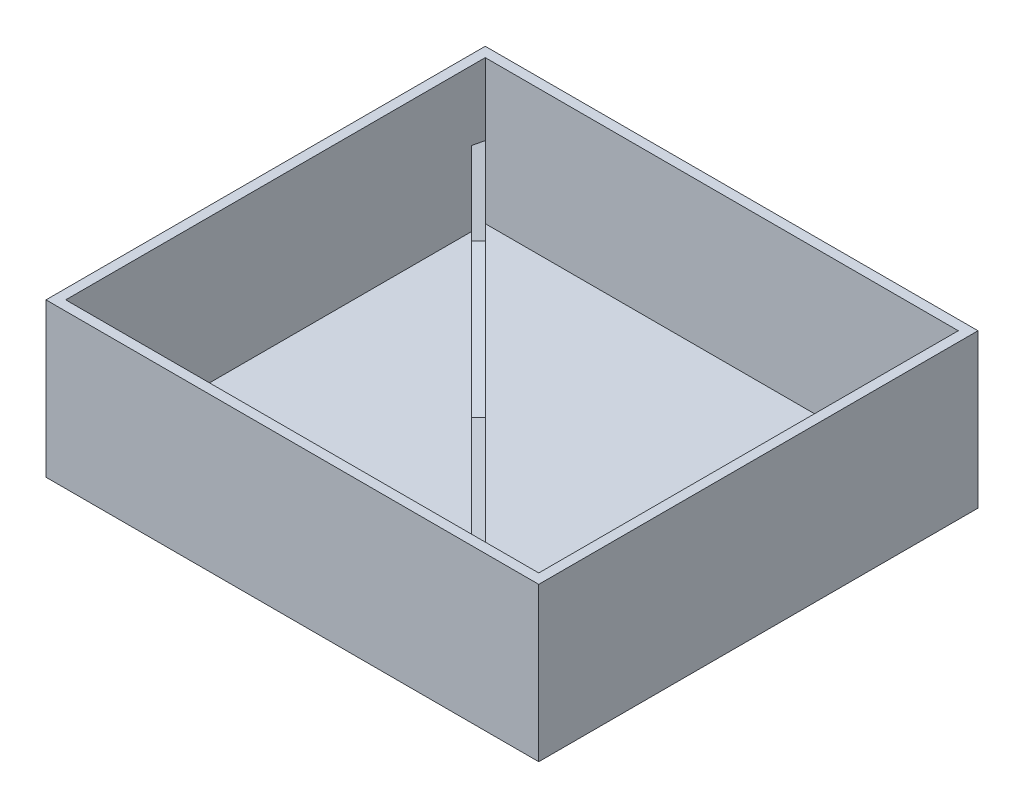
ISO-10303-21;
HEADER;
FILE_DESCRIPTION(('STEP AP214'),'2;1');
FILE_NAME('part.step','',(''),(''),'','','');
FILE_SCHEMA(('AUTOMOTIVE_DESIGN { 1 0 10303 214 1 1 1 1 }'));
ENDSEC;
DATA;
#1=APPLICATION_CONTEXT('core data for automotive mechanical design processes');
#2=APPLICATION_PROTOCOL_DEFINITION('international standard','automotive_design',2000,#1);
#3=PRODUCT_CONTEXT('',#1,'mechanical');
#4=PRODUCT('Part','Part','',(#3));
#5=PRODUCT_RELATED_PRODUCT_CATEGORY('part','',(#4));
#6=PRODUCT_DEFINITION_FORMATION('','',#4);
#7=PRODUCT_DEFINITION_CONTEXT('part definition',#1,'design');
#8=PRODUCT_DEFINITION('design','',#6,#7);
#9=PRODUCT_DEFINITION_SHAPE('','',#8);
#10=(LENGTH_UNIT() NAMED_UNIT(*) SI_UNIT(.MILLI.,.METRE.));
#11=(NAMED_UNIT(*) PLANE_ANGLE_UNIT() SI_UNIT($,.RADIAN.));
#12=(NAMED_UNIT(*) SI_UNIT($,.STERADIAN.) SOLID_ANGLE_UNIT());
#13=UNCERTAINTY_MEASURE_WITH_UNIT(LENGTH_MEASURE(1.E-05),#10,'distance_accuracy_value','');
#14=(GEOMETRIC_REPRESENTATION_CONTEXT(3) GLOBAL_UNCERTAINTY_ASSIGNED_CONTEXT((#13)) GLOBAL_UNIT_ASSIGNED_CONTEXT((#10,
#11,#12)) REPRESENTATION_CONTEXT('',''));
#15=CARTESIAN_POINT('',(0.,0.,0.));
#16=DIRECTION('',(0.,0.,1.));
#17=DIRECTION('',(1.,0.,0.));
#18=AXIS2_PLACEMENT_3D('',#15,#16,#17);
#19=CARTESIAN_POINT('',(0.,2.54,0.));
#20=DIRECTION('',(0.,1.,0.));
#21=DIRECTION('',(0.,0.,1.));
#22=AXIS2_PLACEMENT_3D('',#19,#20,#21);
#23=PLANE('',#22);
#24=DIRECTION('',(-1.,0.,0.));
#25=VECTOR('',#24,1.);
#26=CARTESIAN_POINT('',(-62.4778997860176,2.54,-61.397043942379));
#27=LINE('',#26,#25);
#28=CARTESIAN_POINT('',(62.0602912861796,2.54,-61.397043942379));
#29=VERTEX_POINT('',#28);
#30=CARTESIAN_POINT('',(-59.9378997860176,2.54,-61.3970439423789));
#31=VERTEX_POINT('',#30);
#32=EDGE_CURVE('E205',#29,#31,#27,.T.);
#33=ORIENTED_EDGE('',*,*,#32,.T.);
#34=DIRECTION('',(0.707106781186548,0.,0.707106781186547));
#35=VECTOR('',#34,1.);
#36=CARTESIAN_POINT('',(0.729572078180674,2.54,-0.729572078180674));
#37=LINE('',#36,#35);
#38=CARTESIAN_POINT('',(48.2647465351268,2.54,46.8056023787655));
#39=VERTEX_POINT('',#38);
#40=EDGE_CURVE('E245',#31,#39,#37,.T.);
#41=ORIENTED_EDGE('',*,*,#40,.T.);
#42=DIRECTION('',(1.,0.,0.));
#43=VECTOR('',#42,1.);
#44=CARTESIAN_POINT('',(-62.4778997860176,2.54,46.8056023787655));
#45=LINE('',#44,#43);
#46=CARTESIAN_POINT('',(62.0602912861796,2.54,46.8056023787655));
#47=VERTEX_POINT('',#46);
#48=EDGE_CURVE('E187',#39,#47,#45,.T.);
#49=ORIENTED_EDGE('',*,*,#48,.T.);
#50=DIRECTION('',(0.,0.,-1.));
#51=VECTOR('',#50,1.);
#52=CARTESIAN_POINT('',(62.0602912861796,2.54,-63.9370439423789));
#53=LINE('',#52,#51);
#54=EDGE_CURVE('E198',#47,#29,#53,.T.);
#55=ORIENTED_EDGE('',*,*,#54,.T.);
#56=EDGE_LOOP('',(#33,#41,#49,#55));
#57=FACE_BOUND('',#56,.T.);
#58=ADVANCED_FACE('F43',(#57),#23,.T.);
#59=CARTESIAN_POINT('',(-62.4778997860176,39.624,-63.9370439423789));
#60=DIRECTION('',(1.,0.,0.));
#61=DIRECTION('',(0.,0.,-1.));
#62=AXIS2_PLACEMENT_3D('',#59,#60,#61);
#63=PLANE('',#62);
#64=DIRECTION('',(0.,-1.,0.));
#65=VECTOR('',#64,1.);
#66=CARTESIAN_POINT('',(-62.4778997860176,39.624,-63.9370439423789));
#67=LINE('',#66,#65);
#68=CARTESIAN_POINT('',(-62.4778997860176,39.624,-63.9370439423789));
#69=VERTEX_POINT('',#68);
#70=CARTESIAN_POINT('',(-62.4778997860176,0.,-63.9370439423789));
#71=VERTEX_POINT('',#70);
#72=EDGE_CURVE('E221',#69,#71,#67,.T.);
#73=ORIENTED_EDGE('',*,*,#72,.T.);
#74=DIRECTION('',(0.,0.,1.));
#75=VECTOR('',#74,1.);
#76=CARTESIAN_POINT('',(-62.4778997860176,0.,-63.9370439423789));
#77=LINE('',#76,#75);
#78=CARTESIAN_POINT('',(-62.4778997860176,0.,49.3456023787655));
#79=VERTEX_POINT('',#78);
#80=EDGE_CURVE('E188',#71,#79,#77,.T.);
#81=ORIENTED_EDGE('',*,*,#80,.T.);
#82=DIRECTION('',(0.,-1.,0.));
#83=VECTOR('',#82,1.);
#84=CARTESIAN_POINT('',(-62.4778997860176,39.624,49.3456023787655));
#85=LINE('',#84,#83);
#86=CARTESIAN_POINT('',(-62.4778997860176,39.624,49.3456023787655));
#87=VERTEX_POINT('',#86);
#88=EDGE_CURVE('E237',#87,#79,#85,.T.);
#89=ORIENTED_EDGE('',*,*,#88,.F.);
#90=DIRECTION('',(0.,0.,1.));
#91=VECTOR('',#90,1.);
#92=CARTESIAN_POINT('',(-62.4778997860176,39.624,-63.9370439423789));
#93=LINE('',#92,#91);
#94=EDGE_CURVE('E211',#69,#87,#93,.T.);
#95=ORIENTED_EDGE('',*,*,#94,.F.);
#96=EDGE_LOOP('',(#73,#81,#89,#95));
#97=FACE_BOUND('',#96,.T.);
#98=ADVANCED_FACE('F44',(#97),#63,.F.);
#99=CARTESIAN_POINT('',(-62.4778997860176,39.624,49.3456023787655));
#100=DIRECTION('',(0.,0.,-1.));
#101=DIRECTION('',(-1.,0.,0.));
#102=AXIS2_PLACEMENT_3D('',#99,#100,#101);
#103=PLANE('',#102);
#104=DIRECTION('',(1.,0.,0.));
#105=VECTOR('',#104,1.);
#106=CARTESIAN_POINT('',(-62.4778997860176,0.,49.3456023787655));
#107=LINE('',#106,#105);
#108=CARTESIAN_POINT('',(64.6002912861796,0.,49.3456023787655));
#109=VERTEX_POINT('',#108);
#110=EDGE_CURVE('E228',#79,#109,#107,.T.);
#111=ORIENTED_EDGE('',*,*,#110,.T.);
#112=DIRECTION('',(0.,-1.,0.));
#113=VECTOR('',#112,1.);
#114=CARTESIAN_POINT('',(64.6002912861796,39.624,49.3456023787655));
#115=LINE('',#114,#113);
#116=CARTESIAN_POINT('',(64.6002912861796,39.624,49.3456023787655));
#117=VERTEX_POINT('',#116);
#118=EDGE_CURVE('E236',#117,#109,#115,.T.);
#119=ORIENTED_EDGE('',*,*,#118,.F.);
#120=DIRECTION('',(1.,0.,0.));
#121=VECTOR('',#120,1.);
#122=CARTESIAN_POINT('',(-62.4778997860176,39.624,49.3456023787655));
#123=LINE('',#122,#121);
#124=EDGE_CURVE('E217',#87,#117,#123,.T.);
#125=ORIENTED_EDGE('',*,*,#124,.F.);
#126=ORIENTED_EDGE('',*,*,#88,.T.);
#127=EDGE_LOOP('',(#111,#119,#125,#126));
#128=FACE_BOUND('',#127,.T.);
#129=ADVANCED_FACE('F285',(#128),#103,.F.);
#130=CARTESIAN_POINT('',(64.6002912861796,39.624,-63.9370439423789));
#131=DIRECTION('',(-1.,0.,0.));
#132=DIRECTION('',(0.,0.,1.));
#133=AXIS2_PLACEMENT_3D('',#130,#131,#132);
#134=PLANE('',#133);
#135=DIRECTION('',(0.,0.,-1.));
#136=VECTOR('',#135,1.);
#137=CARTESIAN_POINT('',(64.6002912861796,0.,-63.9370439423789));
#138=LINE('',#137,#136);
#139=CARTESIAN_POINT('',(64.6002912861796,0.,-63.9370439423789));
#140=VERTEX_POINT('',#139);
#141=EDGE_CURVE('E226',#109,#140,#138,.T.);
#142=ORIENTED_EDGE('',*,*,#141,.T.);
#143=DIRECTION('',(0.,-1.,0.));
#144=VECTOR('',#143,1.);
#145=CARTESIAN_POINT('',(64.6002912861796,39.624,-63.9370439423789));
#146=LINE('',#145,#144);
#147=CARTESIAN_POINT('',(64.6002912861796,39.624,-63.9370439423789));
#148=VERTEX_POINT('',#147);
#149=EDGE_CURVE('E231',#148,#140,#146,.T.);
#150=ORIENTED_EDGE('',*,*,#149,.F.);
#151=DIRECTION('',(0.,0.,-1.));
#152=VECTOR('',#151,1.);
#153=CARTESIAN_POINT('',(64.6002912861796,39.624,-63.9370439423789));
#154=LINE('',#153,#152);
#155=EDGE_CURVE('E220',#117,#148,#154,.T.);
#156=ORIENTED_EDGE('',*,*,#155,.F.);
#157=ORIENTED_EDGE('',*,*,#118,.T.);
#158=EDGE_LOOP('',(#142,#150,#156,#157));
#159=FACE_BOUND('',#158,.T.);
#160=ADVANCED_FACE('F300',(#159),#134,.F.);
#161=CARTESIAN_POINT('',(-62.4778997860176,39.624,-63.9370439423789));
#162=DIRECTION('',(0.,0.,1.));
#163=DIRECTION('',(1.,0.,0.));
#164=AXIS2_PLACEMENT_3D('',#161,#162,#163);
#165=PLANE('',#164);
#166=DIRECTION('',(-1.,0.,0.));
#167=VECTOR('',#166,1.);
#168=CARTESIAN_POINT('',(-62.4778997860176,0.,-63.9370439423789));
#169=LINE('',#168,#167);
#170=EDGE_CURVE('E219',#140,#71,#169,.T.);
#171=ORIENTED_EDGE('',*,*,#170,.T.);
#172=ORIENTED_EDGE('',*,*,#72,.F.);
#173=DIRECTION('',(-1.,0.,0.));
#174=VECTOR('',#173,1.);
#175=CARTESIAN_POINT('',(-62.4778997860176,39.624,-63.9370439423789));
#176=LINE('',#175,#174);
#177=EDGE_CURVE('E224',#148,#69,#176,.T.);
#178=ORIENTED_EDGE('',*,*,#177,.F.);
#179=ORIENTED_EDGE('',*,*,#149,.T.);
#180=EDGE_LOOP('',(#171,#172,#178,#179));
#181=FACE_BOUND('',#180,.T.);
#182=ADVANCED_FACE('F293',(#181),#165,.F.);
#183=CARTESIAN_POINT('',(0.,39.624,0.));
#184=DIRECTION('',(0.,1.,0.));
#185=DIRECTION('',(0.,0.,1.));
#186=AXIS2_PLACEMENT_3D('',#183,#184,#185);
#187=PLANE('',#186);
#188=DIRECTION('',(0.,0.,1.));
#189=VECTOR('',#188,1.);
#190=CARTESIAN_POINT('',(-59.9378997860176,39.624,-63.9370439423789));
#191=LINE('',#190,#189);
#192=CARTESIAN_POINT('',(-59.9378997860176,39.624,-61.397043942379));
#193=VERTEX_POINT('',#192);
#194=CARTESIAN_POINT('',(-59.9378997860176,39.624,46.8056023787655));
#195=VERTEX_POINT('',#194);
#196=EDGE_CURVE('E210',#193,#195,#191,.T.);
#197=ORIENTED_EDGE('',*,*,#196,.F.);
#198=DIRECTION('',(-1.,0.,0.));
#199=VECTOR('',#198,1.);
#200=CARTESIAN_POINT('',(-62.4778997860176,39.624,-61.397043942379));
#201=LINE('',#200,#199);
#202=CARTESIAN_POINT('',(62.0602912861796,39.624,-61.397043942379));
#203=VERTEX_POINT('',#202);
#204=EDGE_CURVE('E193',#203,#193,#201,.T.);
#205=ORIENTED_EDGE('',*,*,#204,.F.);
#206=DIRECTION('',(0.,0.,-1.));
#207=VECTOR('',#206,1.);
#208=CARTESIAN_POINT('',(62.0602912861796,39.624,-63.9370439423789));
#209=LINE('',#208,#207);
#210=CARTESIAN_POINT('',(62.0602912861796,39.624,46.8056023787655));
#211=VERTEX_POINT('',#210);
#212=EDGE_CURVE('E212',#211,#203,#209,.T.);
#213=ORIENTED_EDGE('',*,*,#212,.F.);
#214=DIRECTION('',(1.,0.,0.));
#215=VECTOR('',#214,1.);
#216=CARTESIAN_POINT('',(-62.4778997860176,39.624,46.8056023787655));
#217=LINE('',#216,#215);
#218=EDGE_CURVE('E209',#195,#211,#217,.T.);
#219=ORIENTED_EDGE('',*,*,#218,.F.);
#220=EDGE_LOOP('',(#197,#205,#213,#219));
#221=FACE_BOUND('',#220,.T.);
#222=ORIENTED_EDGE('',*,*,#94,.T.);
#223=ORIENTED_EDGE('',*,*,#124,.T.);
#224=ORIENTED_EDGE('',*,*,#155,.T.);
#225=ORIENTED_EDGE('',*,*,#177,.T.);
#226=EDGE_LOOP('',(#222,#223,#224,#225));
#227=FACE_BOUND('',#226,.T.);
#228=ADVANCED_FACE('F261',(#221,#227),#187,.T.);
#229=CARTESIAN_POINT('',(0.,0.,0.));
#230=DIRECTION('',(0.,1.,0.));
#231=DIRECTION('',(0.,0.,1.));
#232=AXIS2_PLACEMENT_3D('',#229,#230,#231);
#233=PLANE('',#232);
#234=ORIENTED_EDGE('',*,*,#110,.F.);
#235=ORIENTED_EDGE('',*,*,#80,.F.);
#236=ORIENTED_EDGE('',*,*,#170,.F.);
#237=ORIENTED_EDGE('',*,*,#141,.F.);
#238=EDGE_LOOP('',(#234,#235,#236,#237));
#239=FACE_BOUND('',#238,.T.);
#240=ADVANCED_FACE('F288',(#239),#233,.F.);
#241=CARTESIAN_POINT('',(-59.9378997860176,39.624,-63.9370439423789));
#242=DIRECTION('',(1.,0.,0.));
#243=DIRECTION('',(0.,0.,-1.));
#244=AXIS2_PLACEMENT_3D('',#241,#242,#243);
#245=PLANE('',#244);
#246=DIRECTION('',(0.,-0.189206076258095,-0.981937401623452));
#247=VECTOR('',#246,1.);
#248=CARTESIAN_POINT('',(-59.9378997860176,21.2739437474469,-60.4012359194636));
#249=LINE('',#248,#247);
#250=CARTESIAN_POINT('',(-59.9378997860176,21.0820649897881,-61.397043942379));
#251=VERTEX_POINT('',#250);
#252=CARTESIAN_POINT('',(-59.9378997860176,21.7742146203658,-57.8049414939513));
#253=VERTEX_POINT('',#252);
#254=EDGE_CURVE('E146',#251,#253,#249,.F.);
#255=ORIENTED_EDGE('',*,*,#254,.F.);
#256=DIRECTION('',(0.,-1.,0.));
#257=VECTOR('',#256,1.);
#258=CARTESIAN_POINT('',(-59.9378997860176,39.624,-61.397043942379));
#259=LINE('',#258,#257);
#260=EDGE_CURVE('E195',#193,#251,#259,.T.);
#261=ORIENTED_EDGE('',*,*,#260,.F.);
#262=ORIENTED_EDGE('',*,*,#196,.T.);
#263=DIRECTION('',(0.,-1.,0.));
#264=VECTOR('',#263,1.);
#265=CARTESIAN_POINT('',(-59.9378997860176,39.624,46.8056023787655));
#266=LINE('',#265,#264);
#267=CARTESIAN_POINT('',(-59.9378997860176,2.54,46.8056023787655));
#268=VERTEX_POINT('',#267);
#269=EDGE_CURVE('E190',#195,#268,#266,.T.);
#270=ORIENTED_EDGE('',*,*,#269,.T.);
#271=DIRECTION('',(0.,0.,1.));
#272=VECTOR('',#271,1.);
#273=CARTESIAN_POINT('',(-59.9378997860176,2.54,-63.9370439423789));
#274=LINE('',#273,#272);
#275=CARTESIAN_POINT('',(-59.9378997860176,2.54,-57.8049414939513));
#276=VERTEX_POINT('',#275);
#277=EDGE_CURVE('E183',#276,#268,#274,.T.);
#278=ORIENTED_EDGE('',*,*,#277,.F.);
#279=DIRECTION('',(0.,-1.,0.));
#280=VECTOR('',#279,1.);
#281=CARTESIAN_POINT('',(-59.9378997860176,39.624,-57.8049414939513));
#282=LINE('',#281,#280);
#283=EDGE_CURVE('E181',#253,#276,#282,.T.);
#284=ORIENTED_EDGE('',*,*,#283,.F.);
#285=EDGE_LOOP('',(#255,#261,#262,#270,#278,#284));
#286=FACE_BOUND('',#285,.T.);
#287=ADVANCED_FACE('F251',(#286),#245,.T.);
#288=CARTESIAN_POINT('',(-62.4778997860176,39.624,46.8056023787655));
#289=DIRECTION('',(0.,0.,-1.));
#290=DIRECTION('',(-1.,0.,0.));
#291=AXIS2_PLACEMENT_3D('',#288,#289,#290);
#292=PLANE('',#291);
#293=DIRECTION('',(0.,1.,0.));
#294=VECTOR('',#293,1.);
#295=CARTESIAN_POINT('',(44.6726440866992,39.624,46.8056023787655));
#296=LINE('',#295,#294);
#297=CARTESIAN_POINT('',(44.6726440866992,2.54,46.8056023787655));
#298=VERTEX_POINT('',#297);
#299=CARTESIAN_POINT('',(44.6726440866992,33.1867342746714,46.8056023787655));
#300=VERTEX_POINT('',#299);
#301=EDGE_CURVE('E177',#298,#300,#296,.T.);
#302=ORIENTED_EDGE('',*,*,#301,.F.);
#303=EDGE_CURVE('E196',#268,#298,#45,.T.);
#304=ORIENTED_EDGE('',*,*,#303,.F.);
#305=ORIENTED_EDGE('',*,*,#269,.F.);
#306=ORIENTED_EDGE('',*,*,#218,.T.);
#307=DIRECTION('',(0.,-1.,0.));
#308=VECTOR('',#307,1.);
#309=CARTESIAN_POINT('',(62.0602912861796,39.624,46.8056023787655));
#310=LINE('',#309,#308);
#311=EDGE_CURVE('E192',#211,#47,#310,.T.);
#312=ORIENTED_EDGE('',*,*,#311,.T.);
#313=ORIENTED_EDGE('',*,*,#48,.F.);
#314=DIRECTION('',(0.,1.,0.));
#315=VECTOR('',#314,1.);
#316=CARTESIAN_POINT('',(48.2647465351269,39.624,46.8056023787655));
#317=LINE('',#316,#315);
#318=CARTESIAN_POINT('',(48.2647465351269,33.5358900537595,46.8056023787655));
#319=VERTEX_POINT('',#318);
#320=EDGE_CURVE('E59',#39,#319,#317,.T.);
#321=ORIENTED_EDGE('',*,*,#320,.T.);
#322=DIRECTION('',(-0.995309200473239,-0.0967450022136603,0.));
#323=VECTOR('',#322,1.);
#324=CARTESIAN_POINT('',(-60.855162060558,22.9293310129866,46.8056023787655));
#325=LINE('',#324,#323);
#326=EDGE_CURVE('E11',#300,#319,#325,.F.);
#327=ORIENTED_EDGE('',*,*,#326,.F.);
#328=EDGE_LOOP('',(#302,#304,#305,#306,#312,#313,#321,#327));
#329=FACE_BOUND('',#328,.T.);
#330=ADVANCED_FACE('F249',(#329),#292,.T.);
#331=CARTESIAN_POINT('',(62.0602912861796,39.624,-63.9370439423789));
#332=DIRECTION('',(-1.,0.,0.));
#333=DIRECTION('',(0.,0.,1.));
#334=AXIS2_PLACEMENT_3D('',#331,#332,#333);
#335=PLANE('',#334);
#336=ORIENTED_EDGE('',*,*,#54,.F.);
#337=ORIENTED_EDGE('',*,*,#311,.F.);
#338=ORIENTED_EDGE('',*,*,#212,.T.);
#339=DIRECTION('',(0.,-1.,0.));
#340=VECTOR('',#339,1.);
#341=CARTESIAN_POINT('',(62.0602912861796,39.624,-61.397043942379));
#342=LINE('',#341,#340);
#343=EDGE_CURVE('E66',#203,#29,#342,.T.);
#344=ORIENTED_EDGE('',*,*,#343,.T.);
#345=EDGE_LOOP('',(#336,#337,#338,#344));
#346=FACE_BOUND('',#345,.T.);
#347=ADVANCED_FACE('F267',(#346),#335,.T.);
#348=CARTESIAN_POINT('',(-62.4778997860176,39.624,-61.397043942379));
#349=DIRECTION('',(0.,0.,1.));
#350=DIRECTION('',(1.,0.,0.));
#351=AXIS2_PLACEMENT_3D('',#348,#349,#350);
#352=PLANE('',#351);
#353=ORIENTED_EDGE('',*,*,#32,.F.);
#354=ORIENTED_EDGE('',*,*,#343,.F.);
#355=ORIENTED_EDGE('',*,*,#204,.T.);
#356=ORIENTED_EDGE('',*,*,#260,.T.);
#357=DIRECTION('',(0.,-1.,0.));
#358=VECTOR('',#357,1.);
#359=CARTESIAN_POINT('',(-59.9378997860176,39.624,-61.397043942379));
#360=LINE('',#359,#358);
#361=EDGE_CURVE('E174',#251,#31,#360,.T.);
#362=ORIENTED_EDGE('',*,*,#361,.T.);
#363=EDGE_LOOP('',(#353,#354,#355,#356,#362));
#364=FACE_BOUND('',#363,.T.);
#365=ADVANCED_FACE('F268',(#364),#352,.T.);
#366=DIRECTION('',(0.707106781186548,0.,0.707106781186547));
#367=VECTOR('',#366,1.);
#368=CARTESIAN_POINT('',(-1.06647914603316,2.54,1.06647914603316));
#369=LINE('',#368,#367);
#370=EDGE_CURVE('E51',#276,#298,#369,.T.);
#371=ORIENTED_EDGE('',*,*,#370,.F.);
#372=ORIENTED_EDGE('',*,*,#277,.T.);
#373=ORIENTED_EDGE('',*,*,#303,.T.);
#374=EDGE_LOOP('',(#371,#372,#373));
#375=FACE_BOUND('',#374,.T.);
#376=ADVANCED_FACE('F255',(#375),#23,.T.);
#377=CARTESIAN_POINT('',(6.19267906962794,25.357,4.73353491326659));
#378=DIRECTION('',(0.0962954087319371,-0.990683798451503,0.0962954087319371));
#379=DIRECTION('',(0.700519231896705,0.136182273022966,0.700519231896705));
#380=AXIS2_PLACEMENT_3D('',#377,#378,#379);
#381=PLANE('',#380);
#382=DIRECTION('',(0.700519231896705,0.136182273022966,0.700519231896705));
#383=VECTOR('',#382,1.);
#384=CARTESIAN_POINT('',(4.39662784541411,25.357,6.52958613748042));
#385=LINE('',#384,#383);
#386=CARTESIAN_POINT('',(4.39662784541411,25.357,6.52958613748042));
#387=VERTEX_POINT('',#386);
#388=EDGE_CURVE('E164',#387,#300,#385,.T.);
#389=ORIENTED_EDGE('',*,*,#388,.T.);
#390=ORIENTED_EDGE('',*,*,#326,.T.);
#391=DIRECTION('',(0.700519231896705,0.136182273022966,0.700519231896705));
#392=VECTOR('',#391,1.);
#393=CARTESIAN_POINT('',(6.19267906962794,25.357,4.73353491326659));
#394=LINE('',#393,#392);
#395=CARTESIAN_POINT('',(6.19267906962794,25.357,4.73353491326659));
#396=VERTEX_POINT('',#395);
#397=EDGE_CURVE('E167',#396,#319,#394,.T.);
#398=ORIENTED_EDGE('',*,*,#397,.F.);
#399=DIRECTION('',(-0.707106781186547,0.,0.707106781186548));
#400=VECTOR('',#399,1.);
#401=CARTESIAN_POINT('',(6.19267906962794,25.357,4.73353491326659));
#402=LINE('',#401,#400);
#403=EDGE_CURVE('E158',#396,#387,#402,.T.);
#404=ORIENTED_EDGE('',*,*,#403,.T.);
#405=EDGE_LOOP('',(#389,#390,#398,#404));
#406=FACE_BOUND('',#405,.T.);
#407=ADVANCED_FACE('F280',(#406),#381,.F.);
#408=CARTESIAN_POINT('',(-23.4746930418348,35.134,-24.9338371981962));
#409=DIRECTION('',(-0.160477384938449,-0.973906575522844,-0.160477384938449));
#410=DIRECTION('',(0.688655943794372,-0.226949294234123,0.688655943794372));
#411=AXIS2_PLACEMENT_3D('',#408,#409,#410);
#412=PLANE('',#411);
#413=ORIENTED_EDGE('',*,*,#403,.F.);
#414=DIRECTION('',(0.688655943794372,-0.226949294234123,0.688655943794372));
#415=VECTOR('',#414,1.);
#416=CARTESIAN_POINT('',(-23.4746930418348,35.134,-24.9338371981962));
#417=LINE('',#416,#415);
#418=CARTESIAN_POINT('',(-23.4746930418348,35.134,-24.9338371981962));
#419=VERTEX_POINT('',#418);
#420=EDGE_CURVE('E156',#419,#396,#417,.T.);
#421=ORIENTED_EDGE('',*,*,#420,.F.);
#422=DIRECTION('',(-0.707106781186547,0.,0.707106781186548));
#423=VECTOR('',#422,1.);
#424=CARTESIAN_POINT('',(-23.4746930418348,35.134,-24.9338371981962));
#425=LINE('',#424,#423);
#426=CARTESIAN_POINT('',(-25.2707442660487,35.134,-23.1377859739824));
#427=VERTEX_POINT('',#426);
#428=EDGE_CURVE('E147',#419,#427,#425,.T.);
#429=ORIENTED_EDGE('',*,*,#428,.T.);
#430=DIRECTION('',(0.688655943794372,-0.226949294234123,0.688655943794372));
#431=VECTOR('',#430,1.);
#432=CARTESIAN_POINT('',(-25.2707442660487,35.134,-23.1377859739824));
#433=LINE('',#432,#431);
#434=EDGE_CURVE('E154',#427,#387,#433,.T.);
#435=ORIENTED_EDGE('',*,*,#434,.T.);
#436=EDGE_LOOP('',(#413,#421,#429,#435));
#437=FACE_BOUND('',#436,.T.);
#438=ADVANCED_FACE('F159',(#437),#412,.F.);
#439=CARTESIAN_POINT('',(-59.9380684272816,21.082,-61.3972125836429));
#440=DIRECTION('',(0.185907687388523,-0.96481949790606,0.185907687388523));
#441=DIRECTION('',(0.682230409590376,0.262913172854267,0.682230409590375));
#442=AXIS2_PLACEMENT_3D('',#439,#440,#441);
#443=PLANE('',#442);
#444=DIRECTION('',(0.682230409590376,0.262913172854267,0.682230409590375));
#445=VECTOR('',#444,1.);
#446=CARTESIAN_POINT('',(-59.9380684272816,21.082,-61.3972125836429));
#447=LINE('',#446,#445);
#448=EDGE_CURVE('E170',#251,#419,#447,.T.);
#449=ORIENTED_EDGE('',*,*,#448,.F.);
#450=ORIENTED_EDGE('',*,*,#254,.T.);
#451=DIRECTION('',(0.682230409590376,0.262913172854267,0.682230409590375));
#452=VECTOR('',#451,1.);
#453=CARTESIAN_POINT('',(-61.7341196514954,21.082,-59.601161359429));
#454=LINE('',#453,#452);
#455=EDGE_CURVE('E145',#253,#427,#454,.T.);
#456=ORIENTED_EDGE('',*,*,#455,.T.);
#457=ORIENTED_EDGE('',*,*,#428,.F.);
#458=EDGE_LOOP('',(#449,#450,#456,#457));
#459=FACE_BOUND('',#458,.T.);
#460=ADVANCED_FACE('F143',(#459),#443,.F.);
#461=CARTESIAN_POINT('',(5.35181126126853,28.0443994247742,7.48476955333484));
#462=DIRECTION('',(-0.707106781186547,0.,0.707106781186548));
#463=DIRECTION('',(0.707106781186548,0.,0.707106781186547));
#464=AXIS2_PLACEMENT_3D('',#461,#462,#463);
#465=PLANE('',#464);
#466=ORIENTED_EDGE('',*,*,#455,.F.);
#467=ORIENTED_EDGE('',*,*,#283,.T.);
#468=ORIENTED_EDGE('',*,*,#370,.T.);
#469=ORIENTED_EDGE('',*,*,#301,.T.);
#470=ORIENTED_EDGE('',*,*,#388,.F.);
#471=ORIENTED_EDGE('',*,*,#434,.F.);
#472=EDGE_LOOP('',(#466,#467,#468,#469,#470,#471));
#473=FACE_BOUND('',#472,.T.);
#474=ADVANCED_FACE('F161',(#473),#465,.T.);
#475=CARTESIAN_POINT('',(7.14786248548236,28.0443994247742,5.68871832912101));
#476=DIRECTION('',(-0.707106781186547,0.,0.707106781186548));
#477=DIRECTION('',(0.707106781186548,0.,0.707106781186547));
#478=AXIS2_PLACEMENT_3D('',#475,#476,#477);
#479=PLANE('',#478);
#480=ORIENTED_EDGE('',*,*,#320,.F.);
#481=ORIENTED_EDGE('',*,*,#40,.F.);
#482=ORIENTED_EDGE('',*,*,#361,.F.);
#483=ORIENTED_EDGE('',*,*,#448,.T.);
#484=ORIENTED_EDGE('',*,*,#420,.T.);
#485=ORIENTED_EDGE('',*,*,#397,.T.);
#486=EDGE_LOOP('',(#480,#481,#482,#483,#484,#485));
#487=FACE_BOUND('',#486,.T.);
#488=ADVANCED_FACE('F266',(#487),#479,.F.);
#489=CLOSED_SHELL('',(#58,#98,#129,#160,#182,#228,#240,#287,#330,#347,#365,#376,#407,#438,#460,
#474,#488));
#490=MANIFOLD_SOLID_BREP('B2',#489);
#491=ADVANCED_BREP_SHAPE_REPRESENTATION('',(#18,#490),#14);
#492=SHAPE_DEFINITION_REPRESENTATION(#9,#491);
ENDSEC;
END-ISO-10303-21;
